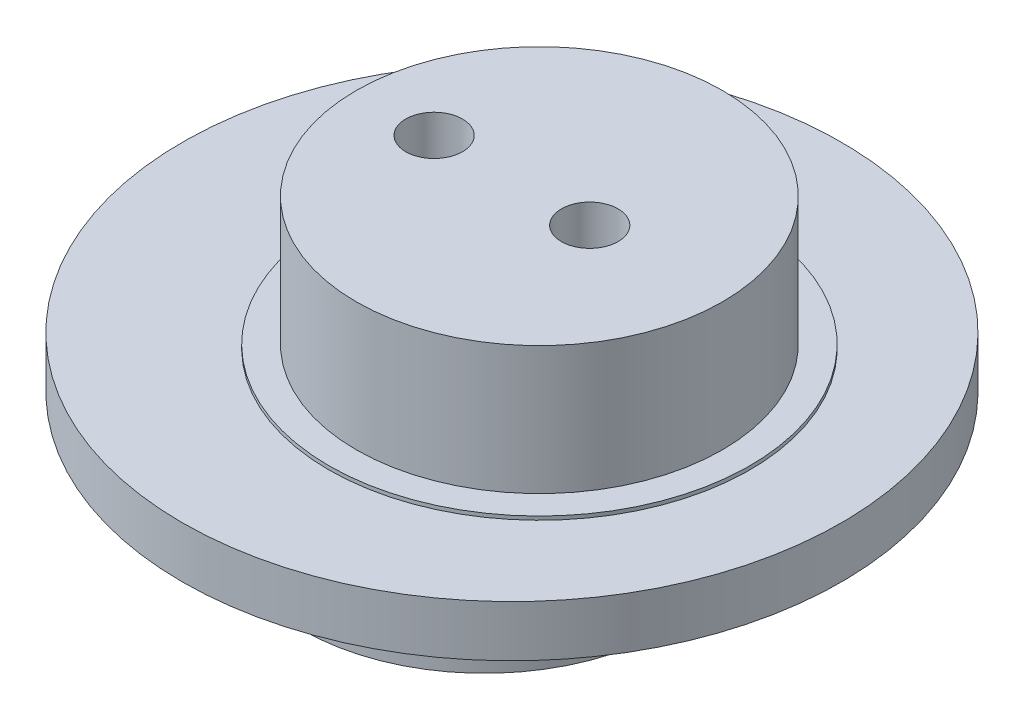
ISO-10303-21;
HEADER;
FILE_DESCRIPTION(('STEP AP214'),'2;1');
FILE_NAME('part.step','',(''),(''),'','','');
FILE_SCHEMA(('AUTOMOTIVE_DESIGN { 1 0 10303 214 1 1 1 1 }'));
ENDSEC;
DATA;
#1=APPLICATION_CONTEXT('core data for automotive mechanical design processes');
#2=APPLICATION_PROTOCOL_DEFINITION('international standard','automotive_design',2000,#1);
#3=PRODUCT_CONTEXT('',#1,'mechanical');
#4=PRODUCT('Part','Part','',(#3));
#5=PRODUCT_RELATED_PRODUCT_CATEGORY('part','',(#4));
#6=PRODUCT_DEFINITION_FORMATION('','',#4);
#7=PRODUCT_DEFINITION_CONTEXT('part definition',#1,'design');
#8=PRODUCT_DEFINITION('design','',#6,#7);
#9=PRODUCT_DEFINITION_SHAPE('','',#8);
#10=(LENGTH_UNIT() NAMED_UNIT(*) SI_UNIT(.MILLI.,.METRE.));
#11=(NAMED_UNIT(*) PLANE_ANGLE_UNIT() SI_UNIT($,.RADIAN.));
#12=(NAMED_UNIT(*) SI_UNIT($,.STERADIAN.) SOLID_ANGLE_UNIT());
#13=UNCERTAINTY_MEASURE_WITH_UNIT(LENGTH_MEASURE(1.E-05),#10,'distance_accuracy_value','');
#14=(GEOMETRIC_REPRESENTATION_CONTEXT(3) GLOBAL_UNCERTAINTY_ASSIGNED_CONTEXT((#13)) GLOBAL_UNIT_ASSIGNED_CONTEXT((#10,
#11,#12)) REPRESENTATION_CONTEXT('',''));
#15=CARTESIAN_POINT('',(0.,0.,0.));
#16=DIRECTION('',(0.,0.,1.));
#17=DIRECTION('',(1.,0.,0.));
#18=AXIS2_PLACEMENT_3D('',#15,#16,#17);
#19=CARTESIAN_POINT('',(0.,2.8,0.));
#20=DIRECTION('',(0.,-1.,0.));
#21=DIRECTION('',(0.,0.,-1.));
#22=AXIS2_PLACEMENT_3D('',#19,#20,#21);
#23=CYLINDRICAL_SURFACE('',#22,18.);
#24=CARTESIAN_POINT('',(0.,2.8,0.));
#25=DIRECTION('',(0.,1.,0.));
#26=DIRECTION('',(0.,0.,1.));
#27=AXIS2_PLACEMENT_3D('',#24,#25,#26);
#28=CIRCLE('',#27,18.);
#29=CARTESIAN_POINT('',(0.,2.8,18.));
#30=VERTEX_POINT('',#29);
#31=EDGE_CURVE('E64',#30,#30,#28,.T.);
#32=ORIENTED_EDGE('',*,*,#31,.F.);
#33=EDGE_LOOP('',(#32));
#34=FACE_BOUND('',#33,.T.);
#35=CARTESIAN_POINT('',(0.,0.,0.));
#36=DIRECTION('',(0.,1.,0.));
#37=DIRECTION('',(0.,0.,1.));
#38=AXIS2_PLACEMENT_3D('',#35,#36,#37);
#39=CIRCLE('',#38,18.);
#40=CARTESIAN_POINT('',(0.,0.,18.));
#41=VERTEX_POINT('',#40);
#42=EDGE_CURVE('E45',#41,#41,#39,.T.);
#43=ORIENTED_EDGE('',*,*,#42,.T.);
#44=EDGE_LOOP('',(#43));
#45=FACE_BOUND('',#44,.T.);
#46=ADVANCED_FACE('F39',(#34,#45),#23,.T.);
#47=CARTESIAN_POINT('',(0.,2.8,0.));
#48=DIRECTION('',(0.,1.,0.));
#49=DIRECTION('',(0.,0.,1.));
#50=AXIS2_PLACEMENT_3D('',#47,#48,#49);
#51=PLANE('',#50);
#52=CARTESIAN_POINT('',(1.5,2.8,0.));
#53=DIRECTION('',(0.,1.,0.));
#54=DIRECTION('',(0.,0.,1.));
#55=AXIS2_PLACEMENT_3D('',#52,#53,#54);
#56=CIRCLE('',#55,11.5);
#57=CARTESIAN_POINT('',(1.5,2.8,11.5));
#58=VERTEX_POINT('',#57);
#59=EDGE_CURVE('E51',#58,#58,#56,.T.);
#60=ORIENTED_EDGE('',*,*,#59,.F.);
#61=EDGE_LOOP('',(#60));
#62=FACE_BOUND('',#61,.T.);
#63=ORIENTED_EDGE('',*,*,#31,.T.);
#64=EDGE_LOOP('',(#63));
#65=FACE_BOUND('',#64,.T.);
#66=ADVANCED_FACE('F73',(#62,#65),#51,.T.);
#67=CARTESIAN_POINT('',(0.,0.,0.));
#68=DIRECTION('',(0.,1.,0.));
#69=DIRECTION('',(0.,0.,1.));
#70=AXIS2_PLACEMENT_3D('',#67,#68,#69);
#71=PLANE('',#70);
#72=CARTESIAN_POINT('',(-1.5,0.,0.));
#73=DIRECTION('',(0.,-1.,0.));
#74=DIRECTION('',(0.,0.,-1.));
#75=AXIS2_PLACEMENT_3D('',#72,#73,#74);
#76=CIRCLE('',#75,10.);
#77=CARTESIAN_POINT('',(-1.5,0.,-10.));
#78=VERTEX_POINT('',#77);
#79=EDGE_CURVE('E10',#78,#78,#76,.T.);
#80=ORIENTED_EDGE('',*,*,#79,.F.);
#81=EDGE_LOOP('',(#80));
#82=FACE_BOUND('',#81,.T.);
#83=ORIENTED_EDGE('',*,*,#42,.F.);
#84=EDGE_LOOP('',(#83));
#85=FACE_BOUND('',#84,.T.);
#86=ADVANCED_FACE('F75',(#82,#85),#71,.F.);
#87=CARTESIAN_POINT('',(1.5,3.,0.));
#88=DIRECTION('',(0.,-1.,0.));
#89=DIRECTION('',(0.,0.,-1.));
#90=AXIS2_PLACEMENT_3D('',#87,#88,#89);
#91=CYLINDRICAL_SURFACE('',#90,11.5);
#92=CARTESIAN_POINT('',(1.5,3.,0.));
#93=DIRECTION('',(0.,1.,0.));
#94=DIRECTION('',(0.,0.,1.));
#95=AXIS2_PLACEMENT_3D('',#92,#93,#94);
#96=CIRCLE('',#95,11.5);
#97=CARTESIAN_POINT('',(1.5,3.,11.5));
#98=VERTEX_POINT('',#97);
#99=EDGE_CURVE('E56',#98,#98,#96,.T.);
#100=ORIENTED_EDGE('',*,*,#99,.F.);
#101=EDGE_LOOP('',(#100));
#102=FACE_BOUND('',#101,.T.);
#103=ORIENTED_EDGE('',*,*,#59,.T.);
#104=EDGE_LOOP('',(#103));
#105=FACE_BOUND('',#104,.T.);
#106=ADVANCED_FACE('F74',(#102,#105),#91,.T.);
#107=CARTESIAN_POINT('',(1.5,3.,0.));
#108=DIRECTION('',(0.,1.,0.));
#109=DIRECTION('',(0.,0.,1.));
#110=AXIS2_PLACEMENT_3D('',#107,#108,#109);
#111=PLANE('',#110);
#112=CARTESIAN_POINT('',(1.5,3.,0.));
#113=DIRECTION('',(0.,1.,0.));
#114=DIRECTION('',(0.,0.,1.));
#115=AXIS2_PLACEMENT_3D('',#112,#113,#114);
#116=CIRCLE('',#115,10.);
#117=CARTESIAN_POINT('',(1.5,3.,10.));
#118=VERTEX_POINT('',#117);
#119=EDGE_CURVE('E46',#118,#118,#116,.T.);
#120=ORIENTED_EDGE('',*,*,#119,.F.);
#121=EDGE_LOOP('',(#120));
#122=FACE_BOUND('',#121,.T.);
#123=ORIENTED_EDGE('',*,*,#99,.T.);
#124=EDGE_LOOP('',(#123));
#125=FACE_BOUND('',#124,.T.);
#126=ADVANCED_FACE('F81',(#122,#125),#111,.T.);
#127=CARTESIAN_POINT('',(1.5,10.,0.));
#128=DIRECTION('',(0.,-1.,0.));
#129=DIRECTION('',(0.,0.,-1.));
#130=AXIS2_PLACEMENT_3D('',#127,#128,#129);
#131=CYLINDRICAL_SURFACE('',#130,10.);
#132=CARTESIAN_POINT('',(1.5,10.,0.));
#133=DIRECTION('',(0.,1.,0.));
#134=DIRECTION('',(0.,0.,1.));
#135=AXIS2_PLACEMENT_3D('',#132,#133,#134);
#136=CIRCLE('',#135,10.);
#137=CARTESIAN_POINT('',(1.5,10.,10.));
#138=VERTEX_POINT('',#137);
#139=EDGE_CURVE('E60',#138,#138,#136,.T.);
#140=ORIENTED_EDGE('',*,*,#139,.F.);
#141=EDGE_LOOP('',(#140));
#142=FACE_BOUND('',#141,.T.);
#143=ORIENTED_EDGE('',*,*,#119,.T.);
#144=EDGE_LOOP('',(#143));
#145=FACE_BOUND('',#144,.T.);
#146=ADVANCED_FACE('F107',(#142,#145),#131,.T.);
#147=CARTESIAN_POINT('',(1.5,10.,0.));
#148=DIRECTION('',(0.,1.,0.));
#149=DIRECTION('',(0.,0.,1.));
#150=AXIS2_PLACEMENT_3D('',#147,#148,#149);
#151=PLANE('',#150);
#152=CARTESIAN_POINT('',(4.25,10.,0.));
#153=DIRECTION('',(0.,1.,0.));
#154=DIRECTION('',(0.,0.,1.));
#155=AXIS2_PLACEMENT_3D('',#152,#153,#154);
#156=CIRCLE('',#155,1.55);
#157=CARTESIAN_POINT('',(4.25,10.,1.55));
#158=VERTEX_POINT('',#157);
#159=EDGE_CURVE('E176',#158,#158,#156,.T.);
#160=ORIENTED_EDGE('',*,*,#159,.F.);
#161=EDGE_LOOP('',(#160));
#162=FACE_BOUND('',#161,.T.);
#163=CARTESIAN_POINT('',(-4.25,10.,0.));
#164=DIRECTION('',(0.,1.,0.));
#165=DIRECTION('',(0.,0.,1.));
#166=AXIS2_PLACEMENT_3D('',#163,#164,#165);
#167=CIRCLE('',#166,1.55);
#168=CARTESIAN_POINT('',(-4.25,10.,1.55));
#169=VERTEX_POINT('',#168);
#170=EDGE_CURVE('E178',#169,#169,#167,.T.);
#171=ORIENTED_EDGE('',*,*,#170,.F.);
#172=EDGE_LOOP('',(#171));
#173=FACE_BOUND('',#172,.T.);
#174=ORIENTED_EDGE('',*,*,#139,.T.);
#175=EDGE_LOOP('',(#174));
#176=FACE_BOUND('',#175,.T.);
#177=ADVANCED_FACE('F118',(#162,#173,#176),#151,.T.);
#178=CARTESIAN_POINT('',(-1.5,-7.,0.));
#179=DIRECTION('',(0.,1.,0.));
#180=DIRECTION('',(0.,0.,1.));
#181=AXIS2_PLACEMENT_3D('',#178,#179,#180);
#182=CYLINDRICAL_SURFACE('',#181,10.);
#183=CARTESIAN_POINT('',(-1.5,-7.,0.));
#184=DIRECTION('',(0.,-1.,0.));
#185=DIRECTION('',(0.,0.,-1.));
#186=AXIS2_PLACEMENT_3D('',#183,#184,#185);
#187=CIRCLE('',#186,10.);
#188=CARTESIAN_POINT('',(-1.5,-7.,-10.));
#189=VERTEX_POINT('',#188);
#190=EDGE_CURVE('E54',#189,#189,#187,.T.);
#191=ORIENTED_EDGE('',*,*,#190,.F.);
#192=EDGE_LOOP('',(#191));
#193=FACE_BOUND('',#192,.T.);
#194=ORIENTED_EDGE('',*,*,#79,.T.);
#195=EDGE_LOOP('',(#194));
#196=FACE_BOUND('',#195,.T.);
#197=ADVANCED_FACE('F129',(#193,#196),#182,.T.);
#198=CARTESIAN_POINT('',(-1.5,-7.,0.));
#199=DIRECTION('',(0.,-1.,0.));
#200=DIRECTION('',(0.,0.,-1.));
#201=AXIS2_PLACEMENT_3D('',#198,#199,#200);
#202=PLANE('',#201);
#203=CARTESIAN_POINT('',(4.25,-7.,0.));
#204=DIRECTION('',(0.,1.,0.));
#205=DIRECTION('',(0.,0.,1.));
#206=AXIS2_PLACEMENT_3D('',#203,#204,#205);
#207=CIRCLE('',#206,1.55);
#208=CARTESIAN_POINT('',(4.25,-7.,1.55));
#209=VERTEX_POINT('',#208);
#210=EDGE_CURVE('E174',#209,#209,#207,.T.);
#211=ORIENTED_EDGE('',*,*,#210,.T.);
#212=EDGE_LOOP('',(#211));
#213=FACE_BOUND('',#212,.T.);
#214=CARTESIAN_POINT('',(-4.25,-7.,0.));
#215=DIRECTION('',(0.,1.,0.));
#216=DIRECTION('',(0.,0.,1.));
#217=AXIS2_PLACEMENT_3D('',#214,#215,#216);
#218=CIRCLE('',#217,1.55);
#219=CARTESIAN_POINT('',(-4.25,-7.,1.55));
#220=VERTEX_POINT('',#219);
#221=EDGE_CURVE('E181',#220,#220,#218,.T.);
#222=ORIENTED_EDGE('',*,*,#221,.T.);
#223=EDGE_LOOP('',(#222));
#224=FACE_BOUND('',#223,.T.);
#225=ORIENTED_EDGE('',*,*,#190,.T.);
#226=EDGE_LOOP('',(#225));
#227=FACE_BOUND('',#226,.T.);
#228=ADVANCED_FACE('F138',(#213,#224,#227),#202,.T.);
#229=CARTESIAN_POINT('',(-4.25,10.,0.));
#230=DIRECTION('',(0.,1.,0.));
#231=DIRECTION('',(0.,0.,1.));
#232=AXIS2_PLACEMENT_3D('',#229,#230,#231);
#233=CYLINDRICAL_SURFACE('',#232,1.55);
#234=ORIENTED_EDGE('',*,*,#221,.F.);
#235=EDGE_LOOP('',(#234));
#236=FACE_BOUND('',#235,.T.);
#237=ORIENTED_EDGE('',*,*,#170,.T.);
#238=EDGE_LOOP('',(#237));
#239=FACE_BOUND('',#238,.T.);
#240=ADVANCED_FACE('F146',(#236,#239),#233,.F.);
#241=CARTESIAN_POINT('',(4.25,10.,0.));
#242=DIRECTION('',(0.,1.,0.));
#243=DIRECTION('',(0.,0.,1.));
#244=AXIS2_PLACEMENT_3D('',#241,#242,#243);
#245=CYLINDRICAL_SURFACE('',#244,1.55);
#246=ORIENTED_EDGE('',*,*,#210,.F.);
#247=EDGE_LOOP('',(#246));
#248=FACE_BOUND('',#247,.T.);
#249=ORIENTED_EDGE('',*,*,#159,.T.);
#250=EDGE_LOOP('',(#249));
#251=FACE_BOUND('',#250,.T.);
#252=ADVANCED_FACE('F158',(#248,#251),#245,.F.);
#253=CLOSED_SHELL('',(#46,#66,#86,#106,#126,#146,#177,#197,#228,#240,#252));
#254=MANIFOLD_SOLID_BREP('B2',#253);
#255=ADVANCED_BREP_SHAPE_REPRESENTATION('',(#18,#254),#14);
#256=SHAPE_DEFINITION_REPRESENTATION(#9,#255);
ENDSEC;
END-ISO-10303-21;
